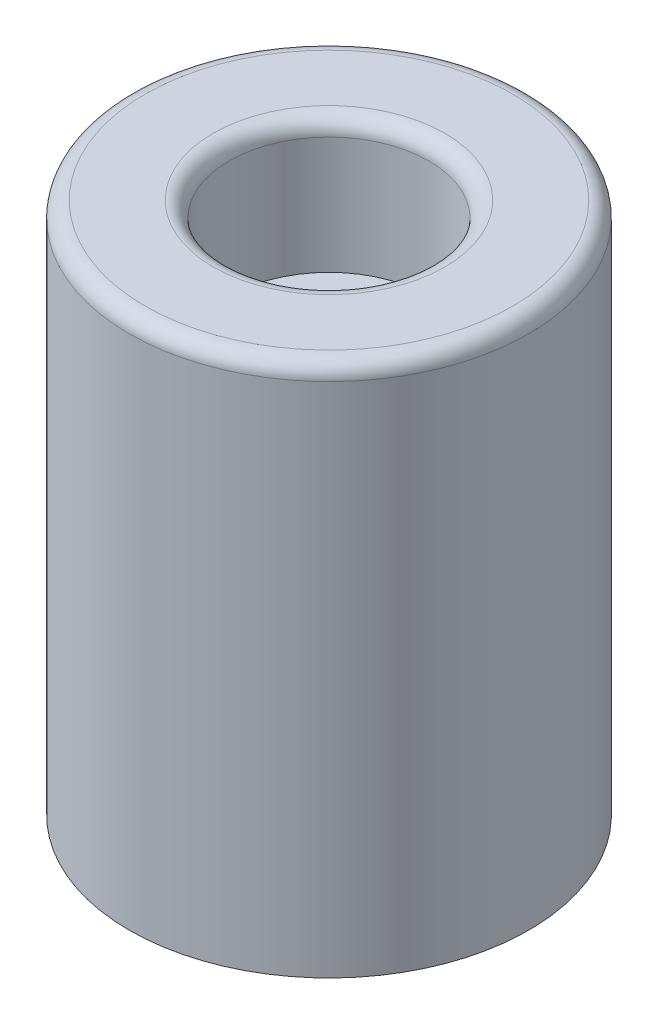
ISO-10303-21;
HEADER;
FILE_DESCRIPTION(('STEP AP214'),'2;1');
FILE_NAME('part.step','',(''),(''),'','','');
FILE_SCHEMA(('AUTOMOTIVE_DESIGN { 1 0 10303 214 1 1 1 1 }'));
ENDSEC;
DATA;
#1=APPLICATION_CONTEXT('core data for automotive mechanical design processes');
#2=APPLICATION_PROTOCOL_DEFINITION('international standard','automotive_design',2000,#1);
#3=PRODUCT_CONTEXT('',#1,'mechanical');
#4=PRODUCT('Part','Part','',(#3));
#5=PRODUCT_RELATED_PRODUCT_CATEGORY('part','',(#4));
#6=PRODUCT_DEFINITION_FORMATION('','',#4);
#7=PRODUCT_DEFINITION_CONTEXT('part definition',#1,'design');
#8=PRODUCT_DEFINITION('design','',#6,#7);
#9=PRODUCT_DEFINITION_SHAPE('','',#8);
#10=(LENGTH_UNIT() NAMED_UNIT(*) SI_UNIT(.MILLI.,.METRE.));
#11=(NAMED_UNIT(*) PLANE_ANGLE_UNIT() SI_UNIT($,.RADIAN.));
#12=(NAMED_UNIT(*) SI_UNIT($,.STERADIAN.) SOLID_ANGLE_UNIT());
#13=UNCERTAINTY_MEASURE_WITH_UNIT(LENGTH_MEASURE(1.E-05),#10,'distance_accuracy_value','');
#14=(GEOMETRIC_REPRESENTATION_CONTEXT(3) GLOBAL_UNCERTAINTY_ASSIGNED_CONTEXT((#13)) GLOBAL_UNIT_ASSIGNED_CONTEXT((#10,
#11,#12)) REPRESENTATION_CONTEXT('',''));
#15=CARTESIAN_POINT('',(0.,0.,0.));
#16=DIRECTION('',(0.,0.,1.));
#17=DIRECTION('',(1.,0.,0.));
#18=AXIS2_PLACEMENT_3D('',#15,#16,#17);
#19=CARTESIAN_POINT('',(0.,25.4,0.));
#20=DIRECTION('',(0.,-1.,0.));
#21=DIRECTION('',(0.,0.,-1.));
#22=AXIS2_PLACEMENT_3D('',#19,#20,#21);
#23=CYLINDRICAL_SURFACE('',#22,9.525);
#24=CARTESIAN_POINT('',(0.,24.638,0.));
#25=DIRECTION('',(0.,1.,0.));
#26=DIRECTION('',(0.,0.,1.));
#27=AXIS2_PLACEMENT_3D('',#24,#25,#26);
#28=CIRCLE('',#27,9.525);
#29=CARTESIAN_POINT('',(0.,24.638,9.525));
#30=VERTEX_POINT('',#29);
#31=EDGE_CURVE('E10',#30,#30,#28,.F.);
#32=ORIENTED_EDGE('',*,*,#31,.T.);
#33=EDGE_LOOP('',(#32));
#34=FACE_BOUND('',#33,.T.);
#35=CARTESIAN_POINT('',(0.,0.,0.));
#36=DIRECTION('',(0.,1.,0.));
#37=DIRECTION('',(0.,0.,1.));
#38=AXIS2_PLACEMENT_3D('',#35,#36,#37);
#39=CIRCLE('',#38,9.525);
#40=CARTESIAN_POINT('',(0.,0.,9.525));
#41=VERTEX_POINT('',#40);
#42=EDGE_CURVE('E61',#41,#41,#39,.T.);
#43=ORIENTED_EDGE('',*,*,#42,.T.);
#44=EDGE_LOOP('',(#43));
#45=FACE_BOUND('',#44,.T.);
#46=ADVANCED_FACE('F37',(#34,#45),#23,.T.);
#47=CARTESIAN_POINT('',(0.,25.4,0.));
#48=DIRECTION('',(0.,1.,0.));
#49=DIRECTION('',(0.,0.,1.));
#50=AXIS2_PLACEMENT_3D('',#47,#48,#49);
#51=PLANE('',#50);
#52=CARTESIAN_POINT('',(0.,25.4,0.));
#53=DIRECTION('',(0.,1.,0.));
#54=DIRECTION('',(0.,0.,1.));
#55=AXIS2_PLACEMENT_3D('',#52,#53,#54);
#56=CIRCLE('',#55,5.5245);
#57=CARTESIAN_POINT('',(0.,25.4,5.5245));
#58=VERTEX_POINT('',#57);
#59=EDGE_CURVE('E45',#58,#58,#56,.F.);
#60=ORIENTED_EDGE('',*,*,#59,.T.);
#61=EDGE_LOOP('',(#60));
#62=FACE_BOUND('',#61,.T.);
#63=CARTESIAN_POINT('',(0.,25.4,0.));
#64=DIRECTION('',(0.,1.,0.));
#65=DIRECTION('',(0.,0.,1.));
#66=AXIS2_PLACEMENT_3D('',#63,#64,#65);
#67=CIRCLE('',#66,8.763);
#68=CARTESIAN_POINT('',(0.,25.4,8.763));
#69=VERTEX_POINT('',#68);
#70=EDGE_CURVE('E50',#69,#69,#67,.T.);
#71=ORIENTED_EDGE('',*,*,#70,.T.);
#72=EDGE_LOOP('',(#71));
#73=FACE_BOUND('',#72,.T.);
#74=ADVANCED_FACE('F101',(#62,#73),#51,.T.);
#75=CARTESIAN_POINT('',(0.,0.,0.));
#76=DIRECTION('',(0.,1.,0.));
#77=DIRECTION('',(0.,0.,1.));
#78=AXIS2_PLACEMENT_3D('',#75,#76,#77);
#79=PLANE('',#78);
#80=CARTESIAN_POINT('',(0.,0.,0.));
#81=DIRECTION('',(0.,1.,0.));
#82=DIRECTION('',(0.,0.,1.));
#83=AXIS2_PLACEMENT_3D('',#80,#81,#82);
#84=CIRCLE('',#83,1.984375);
#85=CARTESIAN_POINT('',(0.,0.,1.984375));
#86=VERTEX_POINT('',#85);
#87=EDGE_CURVE('E69',#86,#86,#84,.T.);
#88=ORIENTED_EDGE('',*,*,#87,.T.);
#89=EDGE_LOOP('',(#88));
#90=FACE_BOUND('',#89,.T.);
#91=ORIENTED_EDGE('',*,*,#42,.F.);
#92=EDGE_LOOP('',(#91));
#93=FACE_BOUND('',#92,.T.);
#94=ADVANCED_FACE('F78',(#90,#93),#79,.F.);
#95=CARTESIAN_POINT('',(0.,19.05,0.));
#96=DIRECTION('',(0.,1.,0.));
#97=DIRECTION('',(0.,0.,1.));
#98=AXIS2_PLACEMENT_3D('',#95,#96,#97);
#99=CYLINDRICAL_SURFACE('',#98,4.7625);
#100=CARTESIAN_POINT('',(0.,24.638,0.));
#101=DIRECTION('',(0.,1.,0.));
#102=DIRECTION('',(0.,0.,1.));
#103=AXIS2_PLACEMENT_3D('',#100,#101,#102);
#104=CIRCLE('',#103,4.7625);
#105=CARTESIAN_POINT('',(0.,24.638,4.7625));
#106=VERTEX_POINT('',#105);
#107=EDGE_CURVE('E55',#106,#106,#104,.T.);
#108=ORIENTED_EDGE('',*,*,#107,.T.);
#109=EDGE_LOOP('',(#108));
#110=FACE_BOUND('',#109,.T.);
#111=CARTESIAN_POINT('',(0.,19.05,0.));
#112=DIRECTION('',(0.,1.,0.));
#113=DIRECTION('',(0.,0.,1.));
#114=AXIS2_PLACEMENT_3D('',#111,#112,#113);
#115=CIRCLE('',#114,4.7625);
#116=CARTESIAN_POINT('',(0.,19.05,4.7625));
#117=VERTEX_POINT('',#116);
#118=EDGE_CURVE('E65',#117,#117,#115,.T.);
#119=ORIENTED_EDGE('',*,*,#118,.F.);
#120=EDGE_LOOP('',(#119));
#121=FACE_BOUND('',#120,.T.);
#122=ADVANCED_FACE('F91',(#110,#121),#99,.F.);
#123=CARTESIAN_POINT('',(0.,19.05,0.));
#124=DIRECTION('',(0.,1.,0.));
#125=DIRECTION('',(0.,0.,1.));
#126=AXIS2_PLACEMENT_3D('',#123,#124,#125);
#127=PLANE('',#126);
#128=CARTESIAN_POINT('',(0.,19.05,0.));
#129=DIRECTION('',(0.,1.,0.));
#130=DIRECTION('',(0.,0.,1.));
#131=AXIS2_PLACEMENT_3D('',#128,#129,#130);
#132=CIRCLE('',#131,1.984375);
#133=CARTESIAN_POINT('',(0.,19.05,1.984375));
#134=VERTEX_POINT('',#133);
#135=EDGE_CURVE('E70',#134,#134,#132,.T.);
#136=ORIENTED_EDGE('',*,*,#135,.F.);
#137=EDGE_LOOP('',(#136));
#138=FACE_BOUND('',#137,.T.);
#139=ORIENTED_EDGE('',*,*,#118,.T.);
#140=EDGE_LOOP('',(#139));
#141=FACE_BOUND('',#140,.T.);
#142=ADVANCED_FACE('F85',(#138,#141),#127,.T.);
#143=CARTESIAN_POINT('',(0.,0.,0.));
#144=DIRECTION('',(0.,1.,0.));
#145=DIRECTION('',(0.,0.,1.));
#146=AXIS2_PLACEMENT_3D('',#143,#144,#145);
#147=CYLINDRICAL_SURFACE('',#146,1.984375);
#148=ORIENTED_EDGE('',*,*,#87,.F.);
#149=EDGE_LOOP('',(#148));
#150=FACE_BOUND('',#149,.T.);
#151=ORIENTED_EDGE('',*,*,#135,.T.);
#152=EDGE_LOOP('',(#151));
#153=FACE_BOUND('',#152,.T.);
#154=ADVANCED_FACE('F81',(#150,#153),#147,.F.);
#155=CARTESIAN_POINT('',(0.,24.638,0.));
#156=DIRECTION('',(0.,1.,0.));
#157=DIRECTION('',(0.,0.,1.));
#158=AXIS2_PLACEMENT_3D('',#155,#156,#157);
#159=TOROIDAL_SURFACE('',#158,5.5245,0.762);
#160=ORIENTED_EDGE('',*,*,#59,.F.);
#161=EDGE_LOOP('',(#160));
#162=FACE_BOUND('',#161,.T.);
#163=ORIENTED_EDGE('',*,*,#107,.F.);
#164=EDGE_LOOP('',(#163));
#165=FACE_BOUND('',#164,.T.);
#166=ADVANCED_FACE('F84',(#162,#165),#159,.T.);
#167=CARTESIAN_POINT('',(0.,24.638,0.));
#168=DIRECTION('',(0.,1.,0.));
#169=DIRECTION('',(0.,0.,1.));
#170=AXIS2_PLACEMENT_3D('',#167,#168,#169);
#171=TOROIDAL_SURFACE('',#170,8.763,0.762);
#172=ORIENTED_EDGE('',*,*,#31,.F.);
#173=EDGE_LOOP('',(#172));
#174=FACE_BOUND('',#173,.T.);
#175=ORIENTED_EDGE('',*,*,#70,.F.);
#176=EDGE_LOOP('',(#175));
#177=FACE_BOUND('',#176,.T.);
#178=ADVANCED_FACE('F39',(#174,#177),#171,.T.);
#179=CLOSED_SHELL('',(#46,#74,#94,#122,#142,#154,#166,#178));
#180=MANIFOLD_SOLID_BREP('B2',#179);
#181=ADVANCED_BREP_SHAPE_REPRESENTATION('',(#18,#180),#14);
#182=SHAPE_DEFINITION_REPRESENTATION(#9,#181);
ENDSEC;
END-ISO-10303-21;
